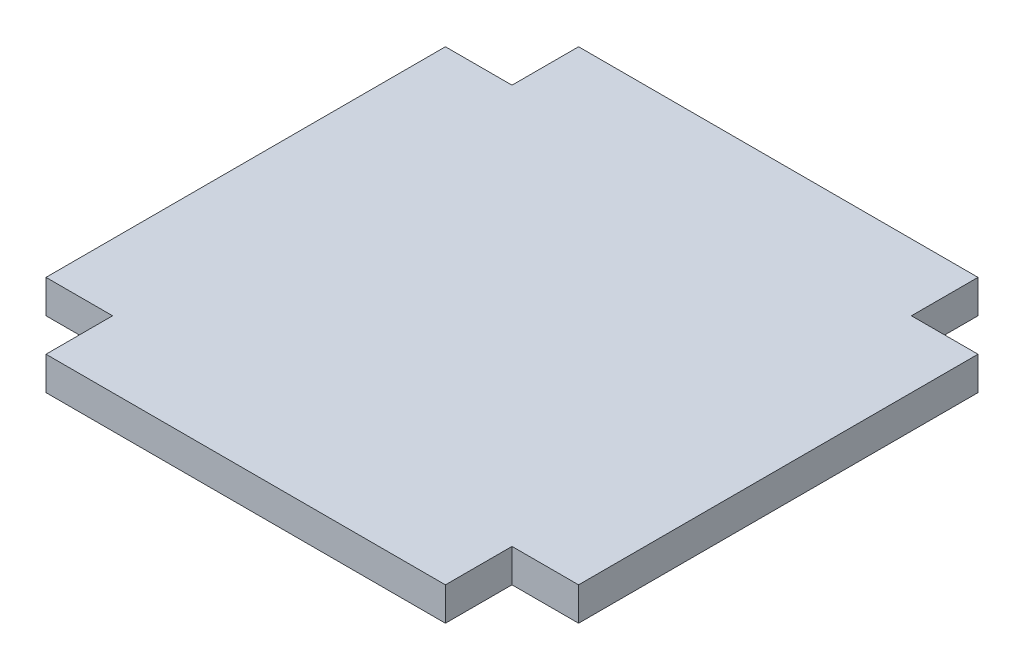
ISO-10303-21;
HEADER;
FILE_DESCRIPTION(('STEP AP214'),'2;1');
FILE_NAME('part.step','',(''),(''),'','','');
FILE_SCHEMA(('AUTOMOTIVE_DESIGN { 1 0 10303 214 1 1 1 1 }'));
ENDSEC;
DATA;
#1=APPLICATION_CONTEXT('core data for automotive mechanical design processes');
#2=APPLICATION_PROTOCOL_DEFINITION('international standard','automotive_design',2000,#1);
#3=PRODUCT_CONTEXT('',#1,'mechanical');
#4=PRODUCT('Part','Part','',(#3));
#5=PRODUCT_RELATED_PRODUCT_CATEGORY('part','',(#4));
#6=PRODUCT_DEFINITION_FORMATION('','',#4);
#7=PRODUCT_DEFINITION_CONTEXT('part definition',#1,'design');
#8=PRODUCT_DEFINITION('design','',#6,#7);
#9=PRODUCT_DEFINITION_SHAPE('','',#8);
#10=(LENGTH_UNIT() NAMED_UNIT(*) SI_UNIT(.MILLI.,.METRE.));
#11=(NAMED_UNIT(*) PLANE_ANGLE_UNIT() SI_UNIT($,.RADIAN.));
#12=(NAMED_UNIT(*) SI_UNIT($,.STERADIAN.) SOLID_ANGLE_UNIT());
#13=UNCERTAINTY_MEASURE_WITH_UNIT(LENGTH_MEASURE(1.E-05),#10,'distance_accuracy_value','');
#14=(GEOMETRIC_REPRESENTATION_CONTEXT(3) GLOBAL_UNCERTAINTY_ASSIGNED_CONTEXT((#13)) GLOBAL_UNIT_ASSIGNED_CONTEXT((#10,
#11,#12)) REPRESENTATION_CONTEXT('',''));
#15=CARTESIAN_POINT('',(0.,0.,0.));
#16=DIRECTION('',(0.,0.,1.));
#17=DIRECTION('',(1.,0.,0.));
#18=AXIS2_PLACEMENT_3D('',#15,#16,#17);
#19=CARTESIAN_POINT('',(0.,3.175,25.9210346394927));
#20=DIRECTION('',(0.,0.,1.));
#21=DIRECTION('',(1.,0.,0.));
#22=AXIS2_PLACEMENT_3D('',#19,#20,#21);
#23=PLANE('',#22);
#24=DIRECTION('',(-1.,0.,0.));
#25=VECTOR('',#24,1.);
#26=CARTESIAN_POINT('',(0.,0.,25.9210346394927));
#27=LINE('',#26,#25);
#28=CARTESIAN_POINT('',(-6.34999999999999,0.,25.9210346394927));
#29=VERTEX_POINT('',#28);
#30=CARTESIAN_POINT('',(-44.45,0.,25.9210346394927));
#31=VERTEX_POINT('',#30);
#32=EDGE_CURVE('E19',#29,#31,#27,.T.);
#33=ORIENTED_EDGE('',*,*,#32,.T.);
#34=DIRECTION('',(0.,-1.,0.));
#35=VECTOR('',#34,1.);
#36=CARTESIAN_POINT('',(-44.45,3.35125974392019,25.9210346394927));
#37=LINE('',#36,#35);
#38=CARTESIAN_POINT('',(-44.45,3.175,25.9210346394927));
#39=VERTEX_POINT('',#38);
#40=EDGE_CURVE('E195',#39,#31,#37,.T.);
#41=ORIENTED_EDGE('',*,*,#40,.F.);
#42=DIRECTION('',(-1.,0.,0.));
#43=VECTOR('',#42,1.);
#44=CARTESIAN_POINT('',(0.,3.175,25.9210346394927));
#45=LINE('',#44,#43);
#46=CARTESIAN_POINT('',(-6.34999999999999,3.175,25.9210346394927));
#47=VERTEX_POINT('',#46);
#48=EDGE_CURVE('E139',#47,#39,#45,.T.);
#49=ORIENTED_EDGE('',*,*,#48,.F.);
#50=DIRECTION('',(0.,-1.,0.));
#51=VECTOR('',#50,1.);
#52=CARTESIAN_POINT('',(-6.34999999999999,3.35125974392019,25.9210346394927));
#53=LINE('',#52,#51);
#54=EDGE_CURVE('E175',#47,#29,#53,.T.);
#55=ORIENTED_EDGE('',*,*,#54,.T.);
#56=EDGE_LOOP('',(#33,#41,#49,#55));
#57=FACE_BOUND('',#56,.T.);
#58=ADVANCED_FACE('F16',(#57),#23,.F.);
#59=CARTESIAN_POINT('',(-50.8,3.175,25.9210346394927));
#60=DIRECTION('',(1.,0.,0.));
#61=DIRECTION('',(0.,0.,-1.));
#62=AXIS2_PLACEMENT_3D('',#59,#60,#61);
#63=PLANE('',#62);
#64=DIRECTION('',(0.,0.,1.));
#65=VECTOR('',#64,1.);
#66=CARTESIAN_POINT('',(-50.8,0.,25.9210346394927));
#67=LINE('',#66,#65);
#68=CARTESIAN_POINT('',(-50.8,0.,32.2710346394927));
#69=VERTEX_POINT('',#68);
#70=CARTESIAN_POINT('',(-50.8,0.,70.3710346394927));
#71=VERTEX_POINT('',#70);
#72=EDGE_CURVE('E131',#69,#71,#67,.T.);
#73=ORIENTED_EDGE('',*,*,#72,.T.);
#74=DIRECTION('',(0.,-1.,0.));
#75=VECTOR('',#74,1.);
#76=CARTESIAN_POINT('',(-50.8,3.35125974392019,70.3710346394927));
#77=LINE('',#76,#75);
#78=CARTESIAN_POINT('',(-50.8,3.175,70.3710346394927));
#79=VERTEX_POINT('',#78);
#80=EDGE_CURVE('E116',#79,#71,#77,.T.);
#81=ORIENTED_EDGE('',*,*,#80,.F.);
#82=DIRECTION('',(0.,0.,1.));
#83=VECTOR('',#82,1.);
#84=CARTESIAN_POINT('',(-50.8,3.175,25.9210346394927));
#85=LINE('',#84,#83);
#86=CARTESIAN_POINT('',(-50.8,3.175,32.2710346394927));
#87=VERTEX_POINT('',#86);
#88=EDGE_CURVE('E145',#87,#79,#85,.T.);
#89=ORIENTED_EDGE('',*,*,#88,.F.);
#90=DIRECTION('',(0.,-1.,0.));
#91=VECTOR('',#90,1.);
#92=CARTESIAN_POINT('',(-50.8,3.35125974392019,32.2710346394927));
#93=LINE('',#92,#91);
#94=EDGE_CURVE('E192',#87,#69,#93,.T.);
#95=ORIENTED_EDGE('',*,*,#94,.T.);
#96=EDGE_LOOP('',(#73,#81,#89,#95));
#97=FACE_BOUND('',#96,.T.);
#98=ADVANCED_FACE('F218',(#97),#63,.F.);
#99=CARTESIAN_POINT('',(-50.8,3.175,76.7210346394927));
#100=DIRECTION('',(0.,0.,-1.));
#101=DIRECTION('',(-1.,0.,0.));
#102=AXIS2_PLACEMENT_3D('',#99,#100,#101);
#103=PLANE('',#102);
#104=DIRECTION('',(1.,0.,0.));
#105=VECTOR('',#104,1.);
#106=CARTESIAN_POINT('',(-50.8,3.175,76.7210346394927));
#107=LINE('',#106,#105);
#108=CARTESIAN_POINT('',(-44.45,3.175,76.7210346394927));
#109=VERTEX_POINT('',#108);
#110=CARTESIAN_POINT('',(-6.34999999999999,3.175,76.7210346394927));
#111=VERTEX_POINT('',#110);
#112=EDGE_CURVE('E24',#109,#111,#107,.T.);
#113=ORIENTED_EDGE('',*,*,#112,.F.);
#114=DIRECTION('',(0.,-1.,0.));
#115=VECTOR('',#114,1.);
#116=CARTESIAN_POINT('',(-44.45,3.35125974392019,76.7210346394927));
#117=LINE('',#116,#115);
#118=CARTESIAN_POINT('',(-44.45,0.,76.7210346394927));
#119=VERTEX_POINT('',#118);
#120=EDGE_CURVE('E110',#109,#119,#117,.T.);
#121=ORIENTED_EDGE('',*,*,#120,.T.);
#122=DIRECTION('',(1.,0.,0.));
#123=VECTOR('',#122,1.);
#124=CARTESIAN_POINT('',(-50.8,0.,76.7210346394927));
#125=LINE('',#124,#123);
#126=CARTESIAN_POINT('',(-6.34999999999999,0.,76.7210346394927));
#127=VERTEX_POINT('',#126);
#128=EDGE_CURVE('E122',#119,#127,#125,.T.);
#129=ORIENTED_EDGE('',*,*,#128,.T.);
#130=DIRECTION('',(0.,-1.,0.));
#131=VECTOR('',#130,1.);
#132=CARTESIAN_POINT('',(-6.34999999999999,3.18600944292834,76.7210346394927));
#133=LINE('',#132,#131);
#134=EDGE_CURVE('E161',#111,#127,#133,.T.);
#135=ORIENTED_EDGE('',*,*,#134,.F.);
#136=EDGE_LOOP('',(#113,#121,#129,#135));
#137=FACE_BOUND('',#136,.T.);
#138=ADVANCED_FACE('F120',(#137),#103,.F.);
#139=CARTESIAN_POINT('',(0.,3.175,76.7210346394927));
#140=DIRECTION('',(-1.,0.,0.));
#141=DIRECTION('',(0.,0.,1.));
#142=AXIS2_PLACEMENT_3D('',#139,#140,#141);
#143=PLANE('',#142);
#144=DIRECTION('',(0.,0.,-1.));
#145=VECTOR('',#144,1.);
#146=CARTESIAN_POINT('',(0.,0.,76.7210346394927));
#147=LINE('',#146,#145);
#148=CARTESIAN_POINT('',(0.,0.,70.3710346394927));
#149=VERTEX_POINT('',#148);
#150=CARTESIAN_POINT('',(0.,0.,32.2710346394927));
#151=VERTEX_POINT('',#150);
#152=EDGE_CURVE('E130',#149,#151,#147,.T.);
#153=ORIENTED_EDGE('',*,*,#152,.T.);
#154=DIRECTION('',(0.,-1.,0.));
#155=VECTOR('',#154,1.);
#156=CARTESIAN_POINT('',(0.,3.35125974392019,32.2710346394927));
#157=LINE('',#156,#155);
#158=CARTESIAN_POINT('',(0.,3.175,32.2710346394927));
#159=VERTEX_POINT('',#158);
#160=EDGE_CURVE('E178',#159,#151,#157,.T.);
#161=ORIENTED_EDGE('',*,*,#160,.F.);
#162=DIRECTION('',(0.,0.,-1.));
#163=VECTOR('',#162,1.);
#164=CARTESIAN_POINT('',(0.,3.175,76.7210346394927));
#165=LINE('',#164,#163);
#166=CARTESIAN_POINT('',(0.,3.175,70.3710346394927));
#167=VERTEX_POINT('',#166);
#168=EDGE_CURVE('E10',#167,#159,#165,.T.);
#169=ORIENTED_EDGE('',*,*,#168,.F.);
#170=DIRECTION('',(0.,-1.,0.));
#171=VECTOR('',#170,1.);
#172=CARTESIAN_POINT('',(0.,3.18600944292834,70.3710346394927));
#173=LINE('',#172,#171);
#174=EDGE_CURVE('E158',#167,#149,#173,.T.);
#175=ORIENTED_EDGE('',*,*,#174,.T.);
#176=EDGE_LOOP('',(#153,#161,#169,#175));
#177=FACE_BOUND('',#176,.T.);
#178=ADVANCED_FACE('F256',(#177),#143,.F.);
#179=CARTESIAN_POINT('',(0.,3.175,0.));
#180=DIRECTION('',(0.,1.,0.));
#181=DIRECTION('',(0.,0.,1.));
#182=AXIS2_PLACEMENT_3D('',#179,#180,#181);
#183=PLANE('',#182);
#184=DIRECTION('',(-1.,0.,0.));
#185=VECTOR('',#184,1.);
#186=CARTESIAN_POINT('',(1.44182227343982E-13,3.175,70.3710346394926));
#187=LINE('',#186,#185);
#188=CARTESIAN_POINT('',(-44.45,3.175,70.3710346394927));
#189=VERTEX_POINT('',#188);
#190=EDGE_CURVE('E200',#189,#79,#187,.T.);
#191=ORIENTED_EDGE('',*,*,#190,.F.);
#192=DIRECTION('',(0.,0.,-1.));
#193=VECTOR('',#192,1.);
#194=CARTESIAN_POINT('',(-44.4500000000001,3.175,0.));
#195=LINE('',#194,#193);
#196=EDGE_CURVE('E203',#109,#189,#195,.T.);
#197=ORIENTED_EDGE('',*,*,#196,.F.);
#198=ORIENTED_EDGE('',*,*,#112,.T.);
#199=DIRECTION('',(0.,0.,1.));
#200=VECTOR('',#199,1.);
#201=CARTESIAN_POINT('',(-6.34999999999998,3.175,0.));
#202=LINE('',#201,#200);
#203=CARTESIAN_POINT('',(-6.34999999999999,3.175,70.3710346394927));
#204=VERTEX_POINT('',#203);
#205=EDGE_CURVE('E150',#204,#111,#202,.T.);
#206=ORIENTED_EDGE('',*,*,#205,.F.);
#207=DIRECTION('',(-1.,0.,0.));
#208=VECTOR('',#207,1.);
#209=CARTESIAN_POINT('',(0.,3.175,70.3710346394927));
#210=LINE('',#209,#208);
#211=EDGE_CURVE('E153',#167,#204,#210,.T.);
#212=ORIENTED_EDGE('',*,*,#211,.F.);
#213=ORIENTED_EDGE('',*,*,#168,.T.);
#214=DIRECTION('',(1.,0.,0.));
#215=VECTOR('',#214,1.);
#216=CARTESIAN_POINT('',(0.,3.175,32.2710346394927));
#217=LINE('',#216,#215);
#218=CARTESIAN_POINT('',(-6.34999999999999,3.175,32.2710346394927));
#219=VERTEX_POINT('',#218);
#220=EDGE_CURVE('E166',#219,#159,#217,.T.);
#221=ORIENTED_EDGE('',*,*,#220,.F.);
#222=DIRECTION('',(0.,0.,1.));
#223=VECTOR('',#222,1.);
#224=CARTESIAN_POINT('',(-6.34999999999999,3.175,0.));
#225=LINE('',#224,#223);
#226=EDGE_CURVE('E170',#47,#219,#225,.T.);
#227=ORIENTED_EDGE('',*,*,#226,.F.);
#228=ORIENTED_EDGE('',*,*,#48,.T.);
#229=DIRECTION('',(0.,0.,-1.));
#230=VECTOR('',#229,1.);
#231=CARTESIAN_POINT('',(-44.45,3.175,0.));
#232=LINE('',#231,#230);
#233=CARTESIAN_POINT('',(-44.45,3.175,32.2710346394927));
#234=VERTEX_POINT('',#233);
#235=EDGE_CURVE('E184',#234,#39,#232,.T.);
#236=ORIENTED_EDGE('',*,*,#235,.F.);
#237=DIRECTION('',(1.,0.,0.));
#238=VECTOR('',#237,1.);
#239=CARTESIAN_POINT('',(0.,3.175,32.2710346394927));
#240=LINE('',#239,#238);
#241=EDGE_CURVE('E188',#87,#234,#240,.T.);
#242=ORIENTED_EDGE('',*,*,#241,.F.);
#243=ORIENTED_EDGE('',*,*,#88,.T.);
#244=EDGE_LOOP('',(#191,#197,#198,#206,#212,#213,#221,#227,#228,#236,#242,#243));
#245=FACE_BOUND('',#244,.T.);
#246=ADVANCED_FACE('F224',(#245),#183,.T.);
#247=CARTESIAN_POINT('',(0.,0.,0.));
#248=DIRECTION('',(0.,1.,0.));
#249=DIRECTION('',(0.,0.,1.));
#250=AXIS2_PLACEMENT_3D('',#247,#248,#249);
#251=PLANE('',#250);
#252=DIRECTION('',(0.,0.,1.));
#253=VECTOR('',#252,1.);
#254=CARTESIAN_POINT('',(-44.45,0.,70.3710346394927));
#255=LINE('',#254,#253);
#256=CARTESIAN_POINT('',(-44.45,0.,70.3710346394927));
#257=VERTEX_POINT('',#256);
#258=EDGE_CURVE('E107',#257,#119,#255,.T.);
#259=ORIENTED_EDGE('',*,*,#258,.F.);
#260=DIRECTION('',(1.,0.,0.));
#261=VECTOR('',#260,1.);
#262=CARTESIAN_POINT('',(-50.8,0.,70.3710346394927));
#263=LINE('',#262,#261);
#264=EDGE_CURVE('E32',#71,#257,#263,.T.);
#265=ORIENTED_EDGE('',*,*,#264,.F.);
#266=ORIENTED_EDGE('',*,*,#72,.F.);
#267=DIRECTION('',(-1.,0.,0.));
#268=VECTOR('',#267,1.);
#269=CARTESIAN_POINT('',(-44.45,0.,32.2710346394927));
#270=LINE('',#269,#268);
#271=CARTESIAN_POINT('',(-44.45,0.,32.2710346394927));
#272=VERTEX_POINT('',#271);
#273=EDGE_CURVE('E197',#272,#69,#270,.T.);
#274=ORIENTED_EDGE('',*,*,#273,.F.);
#275=DIRECTION('',(0.,0.,1.));
#276=VECTOR('',#275,1.);
#277=CARTESIAN_POINT('',(-44.45,0.,25.9210346394927));
#278=LINE('',#277,#276);
#279=EDGE_CURVE('E40',#31,#272,#278,.T.);
#280=ORIENTED_EDGE('',*,*,#279,.F.);
#281=ORIENTED_EDGE('',*,*,#32,.F.);
#282=DIRECTION('',(0.,0.,-1.));
#283=VECTOR('',#282,1.);
#284=CARTESIAN_POINT('',(-6.34999999999999,0.,32.2710346394927));
#285=LINE('',#284,#283);
#286=CARTESIAN_POINT('',(-6.34999999999999,0.,32.2710346394927));
#287=VERTEX_POINT('',#286);
#288=EDGE_CURVE('E180',#287,#29,#285,.T.);
#289=ORIENTED_EDGE('',*,*,#288,.F.);
#290=DIRECTION('',(-1.,0.,0.));
#291=VECTOR('',#290,1.);
#292=CARTESIAN_POINT('',(0.,0.,32.2710346394927));
#293=LINE('',#292,#291);
#294=EDGE_CURVE('E181',#151,#287,#293,.T.);
#295=ORIENTED_EDGE('',*,*,#294,.F.);
#296=ORIENTED_EDGE('',*,*,#152,.F.);
#297=DIRECTION('',(1.,0.,0.));
#298=VECTOR('',#297,1.);
#299=CARTESIAN_POINT('',(-6.34999999999999,0.,70.3710346394927));
#300=LINE('',#299,#298);
#301=CARTESIAN_POINT('',(-6.34999999999999,0.,70.3710346394927));
#302=VERTEX_POINT('',#301);
#303=EDGE_CURVE('E163',#302,#149,#300,.T.);
#304=ORIENTED_EDGE('',*,*,#303,.F.);
#305=DIRECTION('',(0.,0.,-1.));
#306=VECTOR('',#305,1.);
#307=CARTESIAN_POINT('',(-6.34999999999999,0.,76.7210346394927));
#308=LINE('',#307,#306);
#309=EDGE_CURVE('E128',#127,#302,#308,.T.);
#310=ORIENTED_EDGE('',*,*,#309,.F.);
#311=ORIENTED_EDGE('',*,*,#128,.F.);
#312=EDGE_LOOP('',(#259,#265,#266,#274,#280,#281,#289,#295,#296,#304,#310,#311));
#313=FACE_BOUND('',#312,.T.);
#314=ADVANCED_FACE('F126',(#313),#251,.F.);
#315=CARTESIAN_POINT('',(-6.34999999999999,3.18600944292834,76.7210346394927));
#316=DIRECTION('',(-1.,0.,0.));
#317=DIRECTION('',(0.,0.,1.));
#318=AXIS2_PLACEMENT_3D('',#315,#316,#317);
#319=PLANE('',#318);
#320=ORIENTED_EDGE('',*,*,#205,.T.);
#321=ORIENTED_EDGE('',*,*,#134,.T.);
#322=ORIENTED_EDGE('',*,*,#309,.T.);
#323=DIRECTION('',(0.,-1.,0.));
#324=VECTOR('',#323,1.);
#325=CARTESIAN_POINT('',(-6.34999999999999,3.18600944292834,70.3710346394927));
#326=LINE('',#325,#324);
#327=EDGE_CURVE('E155',#204,#302,#326,.T.);
#328=ORIENTED_EDGE('',*,*,#327,.F.);
#329=EDGE_LOOP('',(#320,#321,#322,#328));
#330=FACE_BOUND('',#329,.T.);
#331=ADVANCED_FACE('F261',(#330),#319,.F.);
#332=CARTESIAN_POINT('',(-6.34999999999999,3.18600944292834,70.3710346394927));
#333=DIRECTION('',(0.,0.,-1.));
#334=DIRECTION('',(-1.,0.,0.));
#335=AXIS2_PLACEMENT_3D('',#332,#333,#334);
#336=PLANE('',#335);
#337=ORIENTED_EDGE('',*,*,#211,.T.);
#338=ORIENTED_EDGE('',*,*,#327,.T.);
#339=ORIENTED_EDGE('',*,*,#303,.T.);
#340=ORIENTED_EDGE('',*,*,#174,.F.);
#341=EDGE_LOOP('',(#337,#338,#339,#340));
#342=FACE_BOUND('',#341,.T.);
#343=ADVANCED_FACE('F258',(#342),#336,.F.);
#344=CARTESIAN_POINT('',(0.,3.35125974392019,32.2710346394927));
#345=DIRECTION('',(0.,0.,1.));
#346=DIRECTION('',(1.,0.,0.));
#347=AXIS2_PLACEMENT_3D('',#344,#345,#346);
#348=PLANE('',#347);
#349=ORIENTED_EDGE('',*,*,#220,.T.);
#350=ORIENTED_EDGE('',*,*,#160,.T.);
#351=ORIENTED_EDGE('',*,*,#294,.T.);
#352=DIRECTION('',(0.,-1.,0.));
#353=VECTOR('',#352,1.);
#354=CARTESIAN_POINT('',(-6.34999999999999,3.35125974392019,32.2710346394927));
#355=LINE('',#354,#353);
#356=EDGE_CURVE('E172',#219,#287,#355,.T.);
#357=ORIENTED_EDGE('',*,*,#356,.F.);
#358=EDGE_LOOP('',(#349,#350,#351,#357));
#359=FACE_BOUND('',#358,.T.);
#360=ADVANCED_FACE('F250',(#359),#348,.F.);
#361=CARTESIAN_POINT('',(-6.34999999999999,3.35125974392019,32.2710346394927));
#362=DIRECTION('',(-1.,0.,0.));
#363=DIRECTION('',(0.,0.,1.));
#364=AXIS2_PLACEMENT_3D('',#361,#362,#363);
#365=PLANE('',#364);
#366=ORIENTED_EDGE('',*,*,#226,.T.);
#367=ORIENTED_EDGE('',*,*,#356,.T.);
#368=ORIENTED_EDGE('',*,*,#288,.T.);
#369=ORIENTED_EDGE('',*,*,#54,.F.);
#370=EDGE_LOOP('',(#366,#367,#368,#369));
#371=FACE_BOUND('',#370,.T.);
#372=ADVANCED_FACE('F246',(#371),#365,.F.);
#373=CARTESIAN_POINT('',(-44.45,3.35125974392019,25.9210346394927));
#374=DIRECTION('',(1.,0.,0.));
#375=DIRECTION('',(0.,0.,-1.));
#376=AXIS2_PLACEMENT_3D('',#373,#374,#375);
#377=PLANE('',#376);
#378=ORIENTED_EDGE('',*,*,#235,.T.);
#379=ORIENTED_EDGE('',*,*,#40,.T.);
#380=ORIENTED_EDGE('',*,*,#279,.T.);
#381=DIRECTION('',(0.,-1.,0.));
#382=VECTOR('',#381,1.);
#383=CARTESIAN_POINT('',(-44.45,3.35125974392019,32.2710346394927));
#384=LINE('',#383,#382);
#385=EDGE_CURVE('E190',#234,#272,#384,.T.);
#386=ORIENTED_EDGE('',*,*,#385,.F.);
#387=EDGE_LOOP('',(#378,#379,#380,#386));
#388=FACE_BOUND('',#387,.T.);
#389=ADVANCED_FACE('F228',(#388),#377,.F.);
#390=CARTESIAN_POINT('',(-44.45,3.35125974392019,32.2710346394927));
#391=DIRECTION('',(0.,0.,1.));
#392=DIRECTION('',(1.,0.,0.));
#393=AXIS2_PLACEMENT_3D('',#390,#391,#392);
#394=PLANE('',#393);
#395=ORIENTED_EDGE('',*,*,#241,.T.);
#396=ORIENTED_EDGE('',*,*,#385,.T.);
#397=ORIENTED_EDGE('',*,*,#273,.T.);
#398=ORIENTED_EDGE('',*,*,#94,.F.);
#399=EDGE_LOOP('',(#395,#396,#397,#398));
#400=FACE_BOUND('',#399,.T.);
#401=ADVANCED_FACE('F221',(#400),#394,.F.);
#402=CARTESIAN_POINT('',(-50.8,3.35125974392019,70.3710346394927));
#403=DIRECTION('',(0.,0.,-1.));
#404=DIRECTION('',(-1.,0.,0.));
#405=AXIS2_PLACEMENT_3D('',#402,#403,#404);
#406=PLANE('',#405);
#407=ORIENTED_EDGE('',*,*,#190,.T.);
#408=ORIENTED_EDGE('',*,*,#80,.T.);
#409=ORIENTED_EDGE('',*,*,#264,.T.);
#410=DIRECTION('',(0.,-1.,0.));
#411=VECTOR('',#410,1.);
#412=CARTESIAN_POINT('',(-44.45,3.35125974392019,70.3710346394927));
#413=LINE('',#412,#411);
#414=EDGE_CURVE('E112',#189,#257,#413,.T.);
#415=ORIENTED_EDGE('',*,*,#414,.F.);
#416=EDGE_LOOP('',(#407,#408,#409,#415));
#417=FACE_BOUND('',#416,.T.);
#418=ADVANCED_FACE('F212',(#417),#406,.F.);
#419=CARTESIAN_POINT('',(-44.45,3.35125974392019,70.3710346394927));
#420=DIRECTION('',(1.,0.,0.));
#421=DIRECTION('',(0.,0.,-1.));
#422=AXIS2_PLACEMENT_3D('',#419,#420,#421);
#423=PLANE('',#422);
#424=ORIENTED_EDGE('',*,*,#196,.T.);
#425=ORIENTED_EDGE('',*,*,#414,.T.);
#426=ORIENTED_EDGE('',*,*,#258,.T.);
#427=ORIENTED_EDGE('',*,*,#120,.F.);
#428=EDGE_LOOP('',(#424,#425,#426,#427));
#429=FACE_BOUND('',#428,.T.);
#430=ADVANCED_FACE('F109',(#429),#423,.F.);
#431=CLOSED_SHELL('',(#58,#98,#138,#178,#246,#314,#331,#343,#360,#372,#389,#401,#418,#430));
#432=MANIFOLD_SOLID_BREP('B1',#431);
#433=ADVANCED_BREP_SHAPE_REPRESENTATION('',(#18,#432),#14);
#434=SHAPE_DEFINITION_REPRESENTATION(#9,#433);
ENDSEC;
END-ISO-10303-21;
